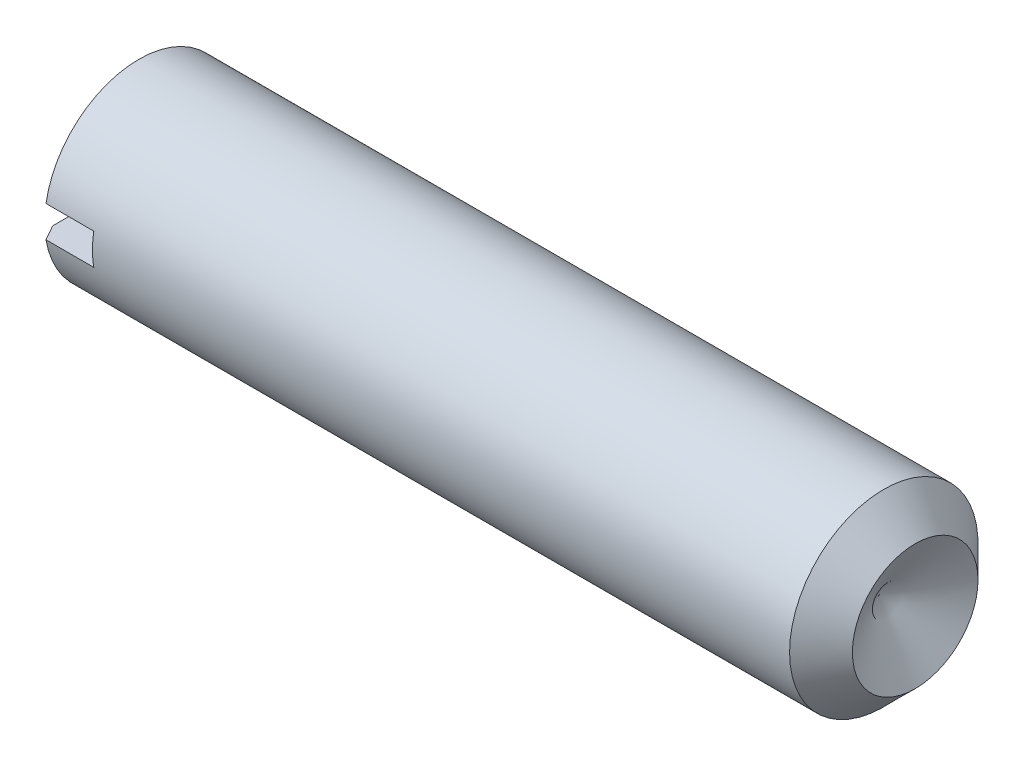
ISO-10303-21;
HEADER;
FILE_DESCRIPTION(('STEP AP214'),'2;1');
FILE_NAME('part.step','',(''),(''),'','','');
FILE_SCHEMA(('AUTOMOTIVE_DESIGN { 1 0 10303 214 1 1 1 1 }'));
ENDSEC;
DATA;
#1=APPLICATION_CONTEXT('core data for automotive mechanical design processes');
#2=APPLICATION_PROTOCOL_DEFINITION('international standard','automotive_design',2000,#1);
#3=PRODUCT_CONTEXT('',#1,'mechanical');
#4=PRODUCT('Part','Part','',(#3));
#5=PRODUCT_RELATED_PRODUCT_CATEGORY('part','',(#4));
#6=PRODUCT_DEFINITION_FORMATION('','',#4);
#7=PRODUCT_DEFINITION_CONTEXT('part definition',#1,'design');
#8=PRODUCT_DEFINITION('design','',#6,#7);
#9=PRODUCT_DEFINITION_SHAPE('','',#8);
#10=(LENGTH_UNIT() NAMED_UNIT(*) SI_UNIT(.MILLI.,.METRE.));
#11=(NAMED_UNIT(*) PLANE_ANGLE_UNIT() SI_UNIT($,.RADIAN.));
#12=(NAMED_UNIT(*) SI_UNIT($,.STERADIAN.) SOLID_ANGLE_UNIT());
#13=UNCERTAINTY_MEASURE_WITH_UNIT(LENGTH_MEASURE(1.E-05),#10,'distance_accuracy_value','');
#14=(GEOMETRIC_REPRESENTATION_CONTEXT(3) GLOBAL_UNCERTAINTY_ASSIGNED_CONTEXT((#13)) GLOBAL_UNIT_ASSIGNED_CONTEXT((#10,
#11,#12)) REPRESENTATION_CONTEXT('',''));
#15=CARTESIAN_POINT('',(0.,0.,0.));
#16=DIRECTION('',(0.,0.,1.));
#17=DIRECTION('',(1.,0.,0.));
#18=AXIS2_PLACEMENT_3D('',#15,#16,#17);
#19=CARTESIAN_POINT('',(0.,0.,0.));
#20=DIRECTION('',(-1.,0.,0.));
#21=DIRECTION('',(0.,0.,1.));
#22=AXIS2_PLACEMENT_3D('',#19,#20,#21);
#23=PLANE('',#22);
#24=CARTESIAN_POINT('',(0.,0.,0.));
#25=DIRECTION('',(-1.,0.,0.));
#26=DIRECTION('',(0.,0.,1.));
#27=AXIS2_PLACEMENT_3D('',#24,#25,#26);
#28=CIRCLE('',#27,5.036);
#29=CARTESIAN_POINT('',(0.,1.,4.93571636138059));
#30=VERTEX_POINT('',#29);
#31=CARTESIAN_POINT('',(0.,1.,-4.93571636138059));
#32=VERTEX_POINT('',#31);
#33=EDGE_CURVE('E111',#30,#32,#28,.T.);
#34=ORIENTED_EDGE('',*,*,#33,.T.);
#35=DIRECTION('',(0.,0.,1.));
#36=VECTOR('',#35,1.);
#37=CARTESIAN_POINT('',(0.,1.,-6.));
#38=LINE('',#37,#36);
#39=EDGE_CURVE('E177',#32,#30,#38,.T.);
#40=ORIENTED_EDGE('',*,*,#39,.T.);
#41=EDGE_LOOP('',(#34,#40));
#42=FACE_BOUND('',#41,.T.);
#43=ADVANCED_FACE('F34',(#42),#23,.T.);
#44=CARTESIAN_POINT('',(0.,-0.999999999999999,-4.93571636138059));
#45=VERTEX_POINT('',#44);
#46=CARTESIAN_POINT('',(0.,-1.,4.93571636138059));
#47=VERTEX_POINT('',#46);
#48=EDGE_CURVE('E107',#45,#47,#28,.T.);
#49=ORIENTED_EDGE('',*,*,#48,.T.);
#50=DIRECTION('',(0.,0.,-1.));
#51=VECTOR('',#50,1.);
#52=CARTESIAN_POINT('',(0.,-0.999999999999999,-6.));
#53=LINE('',#52,#51);
#54=EDGE_CURVE('E99',#47,#45,#53,.T.);
#55=ORIENTED_EDGE('',*,*,#54,.T.);
#56=EDGE_LOOP('',(#49,#55));
#57=FACE_BOUND('',#56,.T.);
#58=ADVANCED_FACE('F169',(#57),#23,.T.);
#59=CARTESIAN_POINT('',(0.,0.,0.));
#60=DIRECTION('',(1.,0.,0.));
#61=DIRECTION('',(0.,0.,-1.));
#62=AXIS2_PLACEMENT_3D('',#59,#60,#61);
#63=CONICAL_SURFACE('',#62,5.036,1.0471975511966);
#64=CARTESIAN_POINT('',(0.5565656594988,0.,0.));
#65=DIRECTION('',(-1.,0.,0.));
#66=DIRECTION('',(0.,0.,1.));
#67=AXIS2_PLACEMENT_3D('',#64,#65,#66);
#68=CIRCLE('',#67,6.);
#69=CARTESIAN_POINT('',(0.5565656594988,0.999999999999999,5.91607978309962));
#70=VERTEX_POINT('',#69);
#71=CARTESIAN_POINT('',(0.5565656594988,1.,-5.91607978309962));
#72=VERTEX_POINT('',#71);
#73=EDGE_CURVE('E104',#70,#72,#68,.T.);
#74=ORIENTED_EDGE('',*,*,#73,.T.);
#75=CARTESIAN_POINT('',(4.73989669271514,1.,-13.2079399731122));
#76=CARTESIAN_POINT('',(4.41853771720275,1.,-12.6497082107171));
#77=CARTESIAN_POINT('',(4.09724308620738,1.,-12.0914392943508));
#78=CARTESIAN_POINT('',(3.45491866839182,1.,-10.9747439104666));
#79=CARTESIAN_POINT('',(3.13388888345056,1.,-10.416317441868));
#80=CARTESIAN_POINT('',(2.49197762047875,1.,-9.29878375972768));
#81=CARTESIAN_POINT('',(2.17109646770066,1.,-8.73967635935326));
#82=CARTESIAN_POINT('',(1.53002759234125,1.,-7.62106803973482));
#83=CARTESIAN_POINT('',(1.2098398657304,1.,-7.0615671228027));
#84=CARTESIAN_POINT('',(0.731752999683985,1.,-6.22374471344359));
#85=CARTESIAN_POINT('',(0.573331144759817,1.,-5.94572157695956));
#86=CARTESIAN_POINT('',(0.25700680573075,1.,-5.38937510078006));
#87=CARTESIAN_POINT('',(0.0991043281520975,1.,-5.11105175737025));
#88=CARTESIAN_POINT('',(-0.215803871687119,1.,-4.5540578090176));
#89=CARTESIAN_POINT('',(-0.372809954009432,1.,-4.27538740768462));
#90=CARTESIAN_POINT('',(-0.685421411461749,1.,-3.71727146951221));
#91=CARTESIAN_POINT('',(-0.841026834596463,1.,-3.43782595967074));
#92=CARTESIAN_POINT('',(-1.07280047051836,1.,-3.01670739395981));
#93=CARTESIAN_POINT('',(-1.15000341162096,1.,-2.87560489491718));
#94=CARTESIAN_POINT('',(-1.30334590311701,1.,-2.59280771309063));
#95=CARTESIAN_POINT('',(-1.37948536629278,1.,-2.45111298296057));
#96=CARTESIAN_POINT('',(-1.53019389021673,1.,-2.16666998976021));
#97=CARTESIAN_POINT('',(-1.60476099220105,1.,-2.02392068095138));
#98=CARTESIAN_POINT('',(-1.71445658720674,1.,-1.80870871103256));
#99=CARTESIAN_POINT('',(-1.75066016319052,1.,-1.73679509885048));
#100=CARTESIAN_POINT('',(-1.82208482318107,1.,-1.59248261773243));
#101=CARTESIAN_POINT('',(-1.85730593731408,1.,-1.52008376376056));
#102=CARTESIAN_POINT('',(-1.92735529771603,1.,-1.37261463948878));
#103=CARTESIAN_POINT('',(-1.96214530553778,1.,-1.29752611216653));
#104=CARTESIAN_POINT('',(-2.02965956084305,1.,-1.1464272735188));
#105=CARTESIAN_POINT('',(-2.06238404828153,1.,-1.07041707049351));
#106=CARTESIAN_POINT('',(-2.12476431844619,1.,-0.917145557122563));
#107=CARTESIAN_POINT('',(-2.15442052211012,1.,-0.83988442007893));
#108=CARTESIAN_POINT('',(-2.20906255805531,1.,-0.683706866904204));
#109=CARTESIAN_POINT('',(-2.23405029456058,1.,-0.604791140337834));
#110=CARTESIAN_POINT('',(-2.2701858104536,1.,-0.470093422562141));
#111=CARTESIAN_POINT('',(-2.28321589301004,1.,-0.414824677608309));
#112=CARTESIAN_POINT('',(-2.3049462303463,1.,-0.303453047162517));
#113=CARTESIAN_POINT('',(-2.31364920633178,1.,-0.247350708818953));
#114=CARTESIAN_POINT('',(-2.32581520982499,1.,-0.134957059900385));
#115=CARTESIAN_POINT('',(-2.32931440889481,1.,-0.0786698056189643));
#116=CARTESIAN_POINT('',(-2.33076867881179,1.,0.0339758725517187));
#117=CARTESIAN_POINT('',(-2.32872385654263,1.,0.0903342950479847));
#118=CARTESIAN_POINT('',(-2.31805799120999,1.,0.217768647722655));
#119=CARTESIAN_POINT('',(-2.30780921847851,1.,0.288706275864185));
#120=CARTESIAN_POINT('',(-2.28041448951625,1.,0.429255862703526));
#121=CARTESIAN_POINT('',(-2.26326048587777,1.,0.498866175055712));
#122=CARTESIAN_POINT('',(-2.2336732423081,1.,0.602653040472886));
#123=CARTESIAN_POINT('',(-2.22308279162358,1.,0.637377371819662));
#124=CARTESIAN_POINT('',(-2.20083833270277,1.,0.706460987269474));
#125=CARTESIAN_POINT('',(-2.18918499575356,1.,0.740820486687518));
#126=CARTESIAN_POINT('',(-2.16499431488939,1.,0.809218732225224));
#127=CARTESIAN_POINT('',(-2.15245710212604,1.,0.843257525085922));
#128=CARTESIAN_POINT('',(-2.12664333011369,1.,0.911058624630585));
#129=CARTESIAN_POINT('',(-2.11336665637935,1.,0.944820887568097));
#130=CARTESIAN_POINT('',(-2.06998388355717,1.,1.05227293315322));
#131=CARTESIAN_POINT('',(-2.03871498859557,1.,1.1254929878084));
#132=CARTESIAN_POINT('',(-1.97418773021611,1.,1.27105481935638));
#133=CARTESIAN_POINT('',(-1.94092900538465,1.,1.34339643380982));
#134=CARTESIAN_POINT('',(-1.87300145739187,1.,1.48745172367306));
#135=CARTESIAN_POINT('',(-1.83833201130301,1.,1.55916510431139));
#136=CARTESIAN_POINT('',(-1.76798292469952,1.,1.7020957142957));
#137=CARTESIAN_POINT('',(-1.73230324722238,1.,1.77331292536865));
#138=CARTESIAN_POINT('',(-1.62404833166124,1.,1.98662313536872));
#139=CARTESIAN_POINT('',(-1.55036430564701,1.,2.12815237228209));
#140=CARTESIAN_POINT('',(-1.40130813476195,1.,2.41025810099267));
#141=CARTESIAN_POINT('',(-1.32593649694034,1.,2.55083486285884));
#142=CARTESIAN_POINT('',(-1.17450983157177,1.,2.83063597104603));
#143=CARTESIAN_POINT('',(-1.0984607133159,1.,2.96986351882429));
#144=CARTESIAN_POINT('',(-0.945628453571545,1.,3.24792809661556));
#145=CARTESIAN_POINT('',(-0.868845256727892,1.,3.38676509614011));
#146=CARTESIAN_POINT('',(-0.637891315016552,1.,3.80258527592079));
#147=CARTESIAN_POINT('',(-0.482967580839101,1.,4.07914988720829));
#148=CARTESIAN_POINT('',(-0.119566497032961,1.,4.72494312842654));
#149=CARTESIAN_POINT('',(0.0893330443967176,0.999999999999999,5.09393352805952));
#150=CARTESIAN_POINT('',(0.50813116989491,0.999999999999999,5.8313517626745));
#151=CARTESIAN_POINT('',(0.718029765114793,0.999999999999999,6.1997795913162));
#152=CARTESIAN_POINT('',(1.13850339248243,0.999999999999999,6.93645171703358));
#153=CARTESIAN_POINT('',(1.34907866934775,0.999999999999999,7.30469587434884));
#154=CARTESIAN_POINT('',(1.77060223251516,0.999999999999999,8.04096877388008));
#155=CARTESIAN_POINT('',(1.98155051744519,0.999999999999999,8.40899751688182));
#156=CARTESIAN_POINT('',(2.40459995529728,0.999999999999999,9.14648067015075));
#157=CARTESIAN_POINT('',(2.61670218630734,0.999999999999999,9.51593446186597));
#158=CARTESIAN_POINT('',(3.04108596616412,0.999999999999999,10.2547396320317));
#159=CARTESIAN_POINT('',(3.25336751523054,0.999999999999999,10.624091010356));
#160=CARTESIAN_POINT('',(3.67796813526823,0.999999999999999,11.3625576054528));
#161=CARTESIAN_POINT('',(3.8902871493782,0.999999999999999,11.7316728549223));
#162=CARTESIAN_POINT('',(4.31502474467981,0.999999999999999,12.4698454062707));
#163=CARTESIAN_POINT('',(4.52744332573743,0.999999999999999,12.8389027082268));
#164=CARTESIAN_POINT('',(4.73989669271514,0.999999999999999,13.2079399731122));
#165=B_SPLINE_CURVE_WITH_KNOTS('',3,(#75,#76,#77,#78,#79,#80,#81,#82,#83,#84,#85,#86,#87,#88,
#89,#90,#91,#92,#93,#94,#95,#96,#97,#98,#99,#100,#101,#102,#103,#104,#105,#106,#107,#108,#109,
#110,#111,#112,#113,#114,#115,#116,#117,#118,#119,#120,#121,#122,#123,#124,#125,#126,#127,#128,
#129,#130,#131,#132,#133,#134,#135,#136,#137,#138,#139,#140,#141,#142,#143,#144,#145,#146,#147,
#148,#149,#150,#151,#152,#153,#154,#155,#156,#157,#158,#159,#160,#161,#162,#163,#164),
.UNSPECIFIED.,.F.,.F.,(4,2,2,2,2,2,2,2,2,2,2,2,2,2,2,2,2,2,2,2,2,2,2,2,2,2,2,2,2,2,2,2,2,2,2,2,
2,2,2,2,2,2,2,2,4),(0.,1.93236881448577,3.86475122216991,5.79868288382603,7.73260327702249,
8.69257649447073,9.65256172875057,10.612129556186,11.5716643702223,12.054187654427,
12.5367502815658,13.019882242275,13.2614145867642,13.5029395167374,13.7511887400155,
13.9994090704805,14.2475953023238,14.4956800792535,14.6658994442621,14.8360116268791,
15.0049357373549,15.1738565911513,15.3884236657494,15.6032415257328,15.7121389898232,
15.8209681475883,15.9297811908741,16.0386111279728,16.2774120534183,16.5162564848264,
16.7552075514775,16.9941673722393,17.4728272005407,17.9513450939743,18.4272722369026,
18.903235555997,19.8542316736438,21.1262890781152,22.3983607146552,23.6709606308449,
24.943555875686,26.2215820771641,27.4996098466158,28.7770795475622,30.0545475337869),.UNSPECIFIED.);
#166=EDGE_CURVE('E132',#72,#32,#165,.T.);
#167=ORIENTED_EDGE('',*,*,#166,.T.);
#168=ORIENTED_EDGE('',*,*,#33,.F.);
#169=EDGE_CURVE('E134',#30,#70,#165,.T.);
#170=ORIENTED_EDGE('',*,*,#169,.T.);
#171=EDGE_LOOP('',(#74,#167,#168,#170));
#172=FACE_BOUND('',#171,.T.);
#173=ADVANCED_FACE('F146',(#172),#63,.T.);
#174=CARTESIAN_POINT('',(0.5565656594988,-0.999999999999999,-5.91607978309962));
#175=VERTEX_POINT('',#174);
#176=CARTESIAN_POINT('',(0.5565656594988,-1.,5.91607978309962));
#177=VERTEX_POINT('',#176);
#178=EDGE_CURVE('E108',#175,#177,#68,.T.);
#179=ORIENTED_EDGE('',*,*,#178,.T.);
#180=CARTESIAN_POINT('',(4.73989669271514,-1.,13.2079399731122));
#181=CARTESIAN_POINT('',(4.41853771720275,-1.,12.649708210717));
#182=CARTESIAN_POINT('',(4.09724308620738,-1.,12.0914392943508));
#183=CARTESIAN_POINT('',(3.45491866839182,-1.,10.9747439104666));
#184=CARTESIAN_POINT('',(3.13388888345056,-1.,10.416317441868));
#185=CARTESIAN_POINT('',(2.49197762047875,-1.,9.29878375972768));
#186=CARTESIAN_POINT('',(2.17109646770066,-1.,8.73967635935326));
#187=CARTESIAN_POINT('',(1.53002759234125,-1.,7.62106803973482));
#188=CARTESIAN_POINT('',(1.2098398657304,-1.,7.0615671228027));
#189=CARTESIAN_POINT('',(0.731752999683986,-1.,6.2237447134436));
#190=CARTESIAN_POINT('',(0.573331144759818,-1.,5.94572157695956));
#191=CARTESIAN_POINT('',(0.257006805730751,-1.,5.38937510078006));
#192=CARTESIAN_POINT('',(0.0991043281520996,-1.,5.11105175737025));
#193=CARTESIAN_POINT('',(-0.215803871687117,-1.,4.55405780901761));
#194=CARTESIAN_POINT('',(-0.372809954009431,-1.,4.27538740768463));
#195=CARTESIAN_POINT('',(-0.685421411461748,-1.,3.71727146951222));
#196=CARTESIAN_POINT('',(-0.841026834596462,-1.,3.43782595967074));
#197=CARTESIAN_POINT('',(-1.07280047051836,-1.,3.01670739395981));
#198=CARTESIAN_POINT('',(-1.15000341162096,-1.,2.87560489491718));
#199=CARTESIAN_POINT('',(-1.30334590311701,-1.,2.59280771309063));
#200=CARTESIAN_POINT('',(-1.37948536629278,-1.,2.45111298296058));
#201=CARTESIAN_POINT('',(-1.53019389021673,-1.,2.16666998976021));
#202=CARTESIAN_POINT('',(-1.60476099220105,-1.,2.02392068095139));
#203=CARTESIAN_POINT('',(-1.71445658720674,-1.,1.80870871103256));
#204=CARTESIAN_POINT('',(-1.75066016319052,-1.,1.73679509885048));
#205=CARTESIAN_POINT('',(-1.82208482318106,-1.,1.59248261773243));
#206=CARTESIAN_POINT('',(-1.85730593731408,-1.,1.52008376376056));
#207=CARTESIAN_POINT('',(-1.92735529771603,-1.,1.37261463948878));
#208=CARTESIAN_POINT('',(-1.96214530553778,-1.,1.29752611216653));
#209=CARTESIAN_POINT('',(-2.02965956084305,-1.,1.1464272735188));
#210=CARTESIAN_POINT('',(-2.06238404828153,-1.,1.07041707049351));
#211=CARTESIAN_POINT('',(-2.12476431844619,-1.,0.917145557122564));
#212=CARTESIAN_POINT('',(-2.15442052211012,-1.,0.839884420078931));
#213=CARTESIAN_POINT('',(-2.2090625580553,-1.,0.683706866904205));
#214=CARTESIAN_POINT('',(-2.23405029456057,-1.,0.604791140337835));
#215=CARTESIAN_POINT('',(-2.2701858104536,-1.,0.470093422562142));
#216=CARTESIAN_POINT('',(-2.28321589301004,-1.,0.41482467760831));
#217=CARTESIAN_POINT('',(-2.3049462303463,-1.,0.303453047162518));
#218=CARTESIAN_POINT('',(-2.31364920633177,-1.,0.247350708818953));
#219=CARTESIAN_POINT('',(-2.32581520982499,-1.,0.134957059900386));
#220=CARTESIAN_POINT('',(-2.32931440889481,-1.,0.0786698056189649));
#221=CARTESIAN_POINT('',(-2.33076867881179,-1.,-0.0339758725517181));
#222=CARTESIAN_POINT('',(-2.32872385654263,-1.,-0.0903342950479841));
#223=CARTESIAN_POINT('',(-2.31805799120999,-1.,-0.217768647722655));
#224=CARTESIAN_POINT('',(-2.30780921847851,-1.,-0.288706275864186));
#225=CARTESIAN_POINT('',(-2.28041448951625,-1.,-0.429255862703526));
#226=CARTESIAN_POINT('',(-2.26326048587777,-1.,-0.498866175055711));
#227=CARTESIAN_POINT('',(-2.2336732423081,-1.,-0.602653040472885));
#228=CARTESIAN_POINT('',(-2.22308279162358,-1.,-0.637377371819661));
#229=CARTESIAN_POINT('',(-2.20083833270277,-1.,-0.706460987269472));
#230=CARTESIAN_POINT('',(-2.18918499575356,-1.,-0.740820486687516));
#231=CARTESIAN_POINT('',(-2.16499431488939,-1.,-0.809218732225223));
#232=CARTESIAN_POINT('',(-2.15245710212604,-1.,-0.843257525085921));
#233=CARTESIAN_POINT('',(-2.12664333011369,-1.,-0.911058624630583));
#234=CARTESIAN_POINT('',(-2.11336665637935,-1.,-0.944820887568096));
#235=CARTESIAN_POINT('',(-2.06998388355717,-1.,-1.05227293315322));
#236=CARTESIAN_POINT('',(-2.03871498859557,-1.,-1.12549298780839));
#237=CARTESIAN_POINT('',(-1.97418773021611,-1.,-1.27105481935638));
#238=CARTESIAN_POINT('',(-1.94092900538466,-1.,-1.34339643380982));
#239=CARTESIAN_POINT('',(-1.87300145739187,-1.,-1.48745172367306));
#240=CARTESIAN_POINT('',(-1.83833201130301,-1.,-1.55916510431139));
#241=CARTESIAN_POINT('',(-1.76798292469952,-1.,-1.7020957142957));
#242=CARTESIAN_POINT('',(-1.73230324722238,-1.,-1.77331292536865));
#243=CARTESIAN_POINT('',(-1.62404833166125,-1.,-1.98662313536872));
#244=CARTESIAN_POINT('',(-1.55036430564701,-1.,-2.12815237228209));
#245=CARTESIAN_POINT('',(-1.40130813476195,-1.,-2.41025810099266));
#246=CARTESIAN_POINT('',(-1.32593649694034,-1.,-2.55083486285883));
#247=CARTESIAN_POINT('',(-1.17450983157177,-1.,-2.83063597104602));
#248=CARTESIAN_POINT('',(-1.09846071331591,-1.,-2.96986351882429));
#249=CARTESIAN_POINT('',(-0.945628453571548,-1.,-3.24792809661556));
#250=CARTESIAN_POINT('',(-0.868845256727895,-1.,-3.3867650961401));
#251=CARTESIAN_POINT('',(-0.637891315016554,-0.999999999999999,-3.80258527592078));
#252=CARTESIAN_POINT('',(-0.482967580839105,-1.,-4.07914988720828));
#253=CARTESIAN_POINT('',(-0.119566497032965,-1.,-4.72494312842653));
#254=CARTESIAN_POINT('',(0.0893330443967138,-0.999999999999999,-5.09393352805951));
#255=CARTESIAN_POINT('',(0.508131169894907,-0.999999999999999,-5.83135176267449));
#256=CARTESIAN_POINT('',(0.718029765114789,-0.999999999999999,-6.1997795913162));
#257=CARTESIAN_POINT('',(1.13850339248243,-0.999999999999999,-6.93645171703358));
#258=CARTESIAN_POINT('',(1.34907866934775,-0.999999999999999,-7.30469587434884));
#259=CARTESIAN_POINT('',(1.77060223251516,-0.999999999999999,-8.04096877388008));
#260=CARTESIAN_POINT('',(1.98155051744519,-0.999999999999999,-8.40899751688181));
#261=CARTESIAN_POINT('',(2.40459995529728,-0.999999999999999,-9.14648067015075));
#262=CARTESIAN_POINT('',(2.61670218630733,-0.999999999999999,-9.51593446186597));
#263=CARTESIAN_POINT('',(3.04108596616412,-0.999999999999999,-10.2547396320317));
#264=CARTESIAN_POINT('',(3.25336751523054,-0.999999999999999,-10.624091010356));
#265=CARTESIAN_POINT('',(3.67796813526823,-0.999999999999999,-11.3625576054528));
#266=CARTESIAN_POINT('',(3.8902871493782,-0.999999999999999,-11.7316728549223));
#267=CARTESIAN_POINT('',(4.31502474467981,-0.999999999999999,-12.4698454062707));
#268=CARTESIAN_POINT('',(4.52744332573743,-0.999999999999999,-12.8389027082268));
#269=CARTESIAN_POINT('',(4.73989669271514,-0.999999999999999,-13.2079399731122));
#270=B_SPLINE_CURVE_WITH_KNOTS('',3,(#180,#181,#182,#183,#184,#185,#186,#187,#188,#189,#190,
#191,#192,#193,#194,#195,#196,#197,#198,#199,#200,#201,#202,#203,#204,#205,#206,#207,#208,#209,
#210,#211,#212,#213,#214,#215,#216,#217,#218,#219,#220,#221,#222,#223,#224,#225,#226,#227,#228,
#229,#230,#231,#232,#233,#234,#235,#236,#237,#238,#239,#240,#241,#242,#243,#244,#245,#246,#247,
#248,#249,#250,#251,#252,#253,#254,#255,#256,#257,#258,#259,#260,#261,#262,#263,#264,#265,#266,
#267,#268,#269),.UNSPECIFIED.,.F.,.F.,(4,2,2,2,2,2,2,2,2,2,2,2,2,2,2,2,2,2,2,2,2,2,2,2,2,2,2,2,
2,2,2,2,2,2,2,2,2,2,2,2,2,2,2,2,4),(0.,1.93236881448577,3.86475122216991,5.79868288382603,
7.73260327702249,8.69257649447072,9.65256172875057,10.612129556186,11.5716643702223,
12.054187654427,12.5367502815658,13.019882242275,13.2614145867642,13.5029395167374,
13.7511887400155,13.9994090704805,14.2475953023238,14.4956800792535,14.6658994442621,
14.8360116268791,15.0049357373549,15.1738565911513,15.3884236657494,15.6032415257328,
15.7121389898232,15.8209681475883,15.9297811908741,16.0386111279728,16.2774120534183,
16.5162564848264,16.7552075514775,16.9941673722393,17.4728272005407,17.9513450939743,
18.4272722369026,18.903235555997,19.8542316736438,21.1262890781152,22.3983607146552,
23.6709606308449,24.943555875686,26.2215820771641,27.4996098466158,28.7770795475622,
30.0545475337869),.UNSPECIFIED.);
#271=EDGE_CURVE('E129',#177,#47,#270,.T.);
#272=ORIENTED_EDGE('',*,*,#271,.T.);
#273=ORIENTED_EDGE('',*,*,#48,.F.);
#274=EDGE_CURVE('E130',#45,#175,#270,.T.);
#275=ORIENTED_EDGE('',*,*,#274,.T.);
#276=EDGE_LOOP('',(#179,#272,#273,#275));
#277=FACE_BOUND('',#276,.T.);
#278=ADVANCED_FACE('F127',(#277),#63,.T.);
#279=CARTESIAN_POINT('',(-12.7,0.,0.));
#280=DIRECTION('',(-1.,0.,0.));
#281=DIRECTION('',(0.,0.,1.));
#282=AXIS2_PLACEMENT_3D('',#279,#280,#281);
#283=CYLINDRICAL_SURFACE('',#282,6.);
#284=CARTESIAN_POINT('',(48.,0.,0.));
#285=DIRECTION('',(-1.,0.,0.));
#286=DIRECTION('',(0.,0.,1.));
#287=AXIS2_PLACEMENT_3D('',#284,#285,#286);
#288=CIRCLE('',#287,6.);
#289=CARTESIAN_POINT('',(48.,0.,6.));
#290=VERTEX_POINT('',#289);
#291=EDGE_CURVE('E114',#290,#290,#288,.T.);
#292=ORIENTED_EDGE('',*,*,#291,.T.);
#293=EDGE_LOOP('',(#292));
#294=FACE_BOUND('',#293,.T.);
#295=ORIENTED_EDGE('',*,*,#73,.F.);
#296=DIRECTION('',(-1.,0.,0.));
#297=VECTOR('',#296,1.);
#298=CARTESIAN_POINT('',(-12.7,0.999999999999999,5.91607978309962));
#299=LINE('',#298,#297);
#300=CARTESIAN_POINT('',(3.6,0.999999999999999,5.91607978309962));
#301=VERTEX_POINT('',#300);
#302=EDGE_CURVE('E11',#70,#301,#299,.F.);
#303=ORIENTED_EDGE('',*,*,#302,.T.);
#304=CARTESIAN_POINT('',(3.6,0.,0.));
#305=DIRECTION('',(1.,0.,0.));
#306=DIRECTION('',(0.,0.,-1.));
#307=AXIS2_PLACEMENT_3D('',#304,#305,#306);
#308=CIRCLE('',#307,6.);
#309=CARTESIAN_POINT('',(3.6,-1.,5.91607978309962));
#310=VERTEX_POINT('',#309);
#311=EDGE_CURVE('E84',#310,#301,#308,.F.);
#312=ORIENTED_EDGE('',*,*,#311,.F.);
#313=DIRECTION('',(-1.,0.,0.));
#314=VECTOR('',#313,1.);
#315=CARTESIAN_POINT('',(-12.7,-1.,5.91607978309962));
#316=LINE('',#315,#314);
#317=EDGE_CURVE('E41',#310,#177,#316,.T.);
#318=ORIENTED_EDGE('',*,*,#317,.T.);
#319=ORIENTED_EDGE('',*,*,#178,.F.);
#320=DIRECTION('',(-1.,0.,0.));
#321=VECTOR('',#320,1.);
#322=CARTESIAN_POINT('',(-12.7,-0.999999999999999,-5.91607978309962));
#323=LINE('',#322,#321);
#324=CARTESIAN_POINT('',(3.6,-0.999999999999999,-5.91607978309962));
#325=VERTEX_POINT('',#324);
#326=EDGE_CURVE('E119',#175,#325,#323,.F.);
#327=ORIENTED_EDGE('',*,*,#326,.T.);
#328=CARTESIAN_POINT('',(3.6,1.,-5.91607978309962));
#329=VERTEX_POINT('',#328);
#330=EDGE_CURVE('E93',#329,#325,#308,.F.);
#331=ORIENTED_EDGE('',*,*,#330,.F.);
#332=DIRECTION('',(-1.,0.,0.));
#333=VECTOR('',#332,1.);
#334=CARTESIAN_POINT('',(-12.7,1.,-5.91607978309962));
#335=LINE('',#334,#333);
#336=EDGE_CURVE('E91',#329,#72,#335,.T.);
#337=ORIENTED_EDGE('',*,*,#336,.T.);
#338=EDGE_LOOP('',(#295,#303,#312,#318,#319,#327,#331,#337));
#339=FACE_BOUND('',#338,.T.);
#340=ADVANCED_FACE('F102',(#294,#339),#283,.T.);
#341=CARTESIAN_POINT('',(50.,0.,0.));
#342=DIRECTION('',(-1.,0.,0.));
#343=DIRECTION('',(0.,0.,1.));
#344=AXIS2_PLACEMENT_3D('',#341,#342,#343);
#345=CONICAL_SURFACE('',#344,4.,0.785398163397446);
#346=ORIENTED_EDGE('',*,*,#291,.F.);
#347=EDGE_LOOP('',(#346));
#348=FACE_BOUND('',#347,.T.);
#349=CARTESIAN_POINT('',(50.,0.,0.));
#350=DIRECTION('',(-1.,0.,0.));
#351=DIRECTION('',(0.,0.,1.));
#352=AXIS2_PLACEMENT_3D('',#349,#350,#351);
#353=CIRCLE('',#352,4.);
#354=CARTESIAN_POINT('',(50.,0.,4.));
#355=VERTEX_POINT('',#354);
#356=EDGE_CURVE('E179',#355,#355,#353,.T.);
#357=ORIENTED_EDGE('',*,*,#356,.T.);
#358=EDGE_LOOP('',(#357));
#359=FACE_BOUND('',#358,.T.);
#360=ADVANCED_FACE('F159',(#348,#359),#345,.T.);
#361=CARTESIAN_POINT('',(50.,0.,0.));
#362=DIRECTION('',(1.,0.,0.));
#363=DIRECTION('',(0.,0.,-1.));
#364=AXIS2_PLACEMENT_3D('',#361,#362,#363);
#365=CONICAL_SURFACE('',#364,4.,1.0471975511966);
#366=CARTESIAN_POINT('',(47.6905989232415,0.,0.));
#367=VERTEX_POINT('',#366);
#368=VERTEX_LOOP('',#367);
#369=FACE_BOUND('',#368,.T.);
#370=ORIENTED_EDGE('',*,*,#356,.F.);
#371=EDGE_LOOP('',(#370));
#372=FACE_BOUND('',#371,.T.);
#373=ADVANCED_FACE('F156',(#369,#372),#365,.F.);
#374=CARTESIAN_POINT('',(3.6,1.,-6.));
#375=DIRECTION('',(0.,-1.,0.));
#376=DIRECTION('',(0.,0.,-1.));
#377=AXIS2_PLACEMENT_3D('',#374,#375,#376);
#378=PLANE('',#377);
#379=ORIENTED_EDGE('',*,*,#39,.F.);
#380=ORIENTED_EDGE('',*,*,#166,.F.);
#381=ORIENTED_EDGE('',*,*,#336,.F.);
#382=DIRECTION('',(0.,0.,1.));
#383=VECTOR('',#382,1.);
#384=CARTESIAN_POINT('',(3.6,1.,-6.));
#385=LINE('',#384,#383);
#386=EDGE_CURVE('E48',#329,#301,#385,.T.);
#387=ORIENTED_EDGE('',*,*,#386,.T.);
#388=ORIENTED_EDGE('',*,*,#302,.F.);
#389=ORIENTED_EDGE('',*,*,#169,.F.);
#390=EDGE_LOOP('',(#379,#380,#381,#387,#388,#389));
#391=FACE_BOUND('',#390,.T.);
#392=ADVANCED_FACE('F95',(#391),#378,.T.);
#393=CARTESIAN_POINT('',(3.6,-0.999999999999999,-6.));
#394=DIRECTION('',(0.,1.,0.));
#395=DIRECTION('',(0.,0.,1.));
#396=AXIS2_PLACEMENT_3D('',#393,#394,#395);
#397=PLANE('',#396);
#398=ORIENTED_EDGE('',*,*,#54,.F.);
#399=ORIENTED_EDGE('',*,*,#271,.F.);
#400=ORIENTED_EDGE('',*,*,#317,.F.);
#401=DIRECTION('',(0.,0.,-1.));
#402=VECTOR('',#401,1.);
#403=CARTESIAN_POINT('',(3.6,-0.999999999999999,-6.));
#404=LINE('',#403,#402);
#405=EDGE_CURVE('E87',#310,#325,#404,.T.);
#406=ORIENTED_EDGE('',*,*,#405,.T.);
#407=ORIENTED_EDGE('',*,*,#326,.F.);
#408=ORIENTED_EDGE('',*,*,#274,.F.);
#409=EDGE_LOOP('',(#398,#399,#400,#406,#407,#408));
#410=FACE_BOUND('',#409,.T.);
#411=ADVANCED_FACE('F149',(#410),#397,.T.);
#412=CARTESIAN_POINT('',(3.6,1.,-6.));
#413=DIRECTION('',(1.,0.,0.));
#414=DIRECTION('',(0.,0.,-1.));
#415=AXIS2_PLACEMENT_3D('',#412,#413,#414);
#416=PLANE('',#415);
#417=ORIENTED_EDGE('',*,*,#405,.F.);
#418=ORIENTED_EDGE('',*,*,#311,.T.);
#419=ORIENTED_EDGE('',*,*,#386,.F.);
#420=ORIENTED_EDGE('',*,*,#330,.T.);
#421=EDGE_LOOP('',(#417,#418,#419,#420));
#422=FACE_BOUND('',#421,.T.);
#423=ADVANCED_FACE('F85',(#422),#416,.F.);
#424=CLOSED_SHELL('',(#43,#58,#173,#278,#340,#360,#373,#392,#411,#423));
#425=MANIFOLD_SOLID_BREP('B2',#424);
#426=ADVANCED_BREP_SHAPE_REPRESENTATION('',(#18,#425),#14);
#427=SHAPE_DEFINITION_REPRESENTATION(#9,#426);
ENDSEC;
END-ISO-10303-21;
